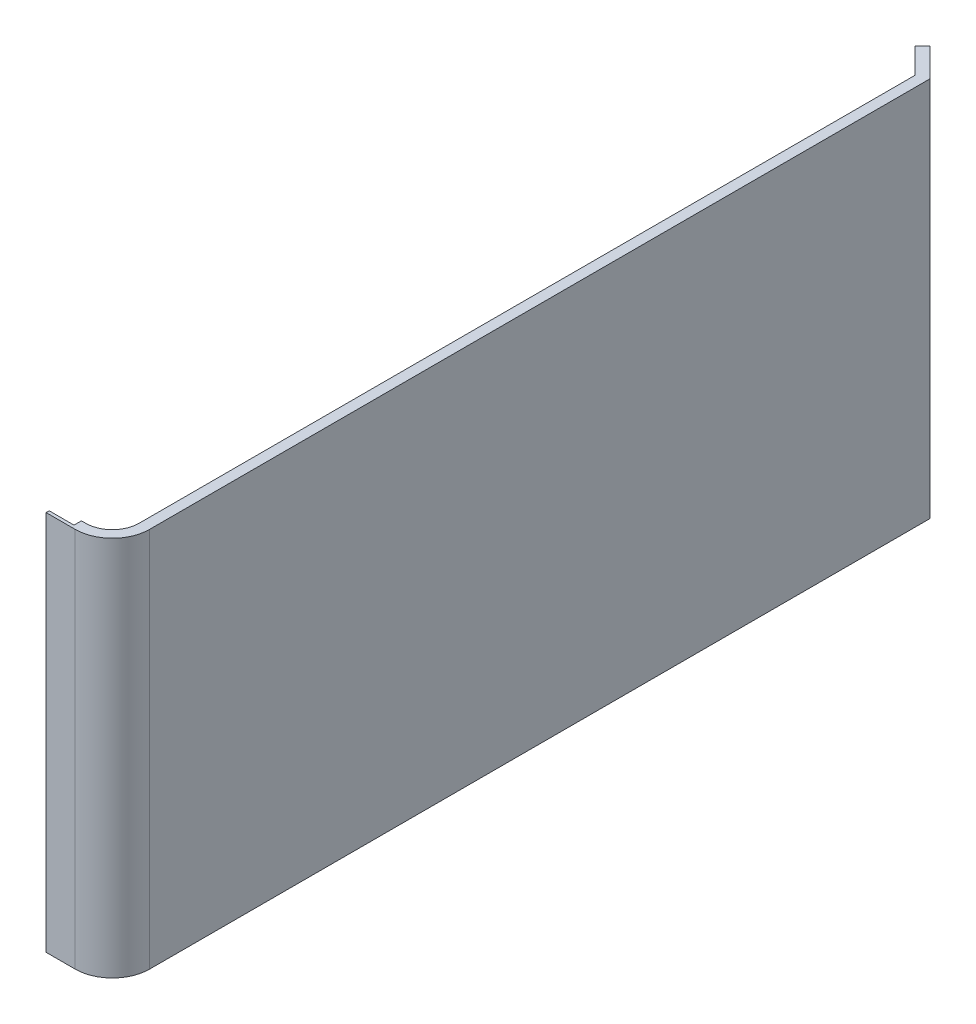
ISO-10303-21;
HEADER;
FILE_DESCRIPTION(('STEP AP214'),'2;1');
FILE_NAME('part.step','',(''),(''),'','','');
FILE_SCHEMA(('AUTOMOTIVE_DESIGN { 1 0 10303 214 1 1 1 1 }'));
ENDSEC;
DATA;
#1=APPLICATION_CONTEXT('core data for automotive mechanical design processes');
#2=APPLICATION_PROTOCOL_DEFINITION('international standard','automotive_design',2000,#1);
#3=PRODUCT_CONTEXT('',#1,'mechanical');
#4=PRODUCT('Part','Part','',(#3));
#5=PRODUCT_RELATED_PRODUCT_CATEGORY('part','',(#4));
#6=PRODUCT_DEFINITION_FORMATION('','',#4);
#7=PRODUCT_DEFINITION_CONTEXT('part definition',#1,'design');
#8=PRODUCT_DEFINITION('design','',#6,#7);
#9=PRODUCT_DEFINITION_SHAPE('','',#8);
#10=(LENGTH_UNIT() NAMED_UNIT(*) SI_UNIT(.MILLI.,.METRE.));
#11=(NAMED_UNIT(*) PLANE_ANGLE_UNIT() SI_UNIT($,.RADIAN.));
#12=(NAMED_UNIT(*) SI_UNIT($,.STERADIAN.) SOLID_ANGLE_UNIT());
#13=UNCERTAINTY_MEASURE_WITH_UNIT(LENGTH_MEASURE(1.E-05),#10,'distance_accuracy_value','');
#14=(GEOMETRIC_REPRESENTATION_CONTEXT(3) GLOBAL_UNCERTAINTY_ASSIGNED_CONTEXT((#13)) GLOBAL_UNIT_ASSIGNED_CONTEXT((#10,
#11,#12)) REPRESENTATION_CONTEXT('',''));
#15=CARTESIAN_POINT('',(0.,0.,0.));
#16=DIRECTION('',(0.,0.,1.));
#17=DIRECTION('',(1.,0.,0.));
#18=AXIS2_PLACEMENT_3D('',#15,#16,#17);
#19=CARTESIAN_POINT('',(727.000000000045,-43.4999999999996,1347.99999999955));
#20=DIRECTION('',(0.,1.,0.));
#21=DIRECTION('',(0.,0.,1.));
#22=AXIS2_PLACEMENT_3D('',#19,#20,#21);
#23=PLANE('',#22);
#24=CARTESIAN_POINT('',(667.000000000045,-43.4999999999996,1949.99999999955));
#25=DIRECTION('',(0.,1.,0.));
#26=DIRECTION('',(0.,0.,1.));
#27=AXIS2_PLACEMENT_3D('',#24,#25,#26);
#28=CIRCLE('',#27,60.);
#29=CARTESIAN_POINT('',(667.000000000045,-43.4999999999996,2009.99999999955));
#30=VERTEX_POINT('',#29);
#31=CARTESIAN_POINT('',(727.000000000045,-43.4999999999996,1949.99999999955));
#32=VERTEX_POINT('',#31);
#33=EDGE_CURVE('E117',#30,#32,#28,.T.);
#34=ORIENTED_EDGE('',*,*,#33,.F.);
#35=DIRECTION('',(1.,0.,0.));
#36=VECTOR('',#35,1.);
#37=CARTESIAN_POINT('',(620.000000000045,-43.4999999999996,2009.99999999955));
#38=LINE('',#37,#36);
#39=CARTESIAN_POINT('',(620.000000000045,-43.4999999999996,2009.99999999955));
#40=VERTEX_POINT('',#39);
#41=EDGE_CURVE('E36',#40,#30,#38,.T.);
#42=ORIENTED_EDGE('',*,*,#41,.F.);
#43=DIRECTION('',(0.,0.,1.));
#44=VECTOR('',#43,1.);
#45=CARTESIAN_POINT('',(620.000000000045,-43.4999999999996,2004.99999999954));
#46=LINE('',#45,#44);
#47=CARTESIAN_POINT('',(620.000000000045,-43.4999999999996,2004.99999999954));
#48=VERTEX_POINT('',#47);
#49=EDGE_CURVE('E161',#48,#40,#46,.T.);
#50=ORIENTED_EDGE('',*,*,#49,.F.);
#51=DIRECTION('',(-1.,0.,0.));
#52=VECTOR('',#51,1.);
#53=CARTESIAN_POINT('',(660.000000000045,-43.4999999999996,2004.99999999954));
#54=LINE('',#53,#52);
#55=CARTESIAN_POINT('',(660.000000000045,-43.4999999999996,2004.99999999954));
#56=VERTEX_POINT('',#55);
#57=EDGE_CURVE('E149',#56,#48,#54,.T.);
#58=ORIENTED_EDGE('',*,*,#57,.F.);
#59=DIRECTION('',(0.,0.,1.));
#60=VECTOR('',#59,1.);
#61=CARTESIAN_POINT('',(660.000000000045,-43.4999999999996,1992.99999999955));
#62=LINE('',#61,#60);
#63=CARTESIAN_POINT('',(660.000000000045,-43.4999999999996,1992.99999999955));
#64=VERTEX_POINT('',#63);
#65=EDGE_CURVE('E139',#64,#56,#62,.T.);
#66=ORIENTED_EDGE('',*,*,#65,.F.);
#67=DIRECTION('',(-1.,0.,0.));
#68=VECTOR('',#67,1.);
#69=CARTESIAN_POINT('',(667.000000000045,-43.4999999999996,1992.99999999955));
#70=LINE('',#69,#68);
#71=CARTESIAN_POINT('',(667.000000000045,-43.4999999999996,1992.99999999955));
#72=VERTEX_POINT('',#71);
#73=EDGE_CURVE('E140',#72,#64,#70,.T.);
#74=ORIENTED_EDGE('',*,*,#73,.F.);
#75=CARTESIAN_POINT('',(667.000000000045,-43.4999999999996,1949.99999999955));
#76=DIRECTION('',(0.,-1.,0.));
#77=DIRECTION('',(1.,0.,0.));
#78=AXIS2_PLACEMENT_3D('',#75,#76,#77);
#79=CIRCLE('',#78,43.);
#80=CARTESIAN_POINT('',(710.000000000045,-43.4999999999996,1949.99999999955));
#81=VERTEX_POINT('',#80);
#82=EDGE_CURVE('E177',#81,#72,#79,.T.);
#83=ORIENTED_EDGE('',*,*,#82,.F.);
#84=DIRECTION('',(0.,0.,1.));
#85=VECTOR('',#84,1.);
#86=CARTESIAN_POINT('',(710.000000000045,-43.5,697.041630559846));
#87=LINE('',#86,#85);
#88=CARTESIAN_POINT('',(710.000000000045,-43.5,697.041630559846));
#89=VERTEX_POINT('',#88);
#90=EDGE_CURVE('E133',#89,#81,#87,.T.);
#91=ORIENTED_EDGE('',*,*,#90,.F.);
#92=DIRECTION('',(0.707106781186548,0.,0.707106781186548));
#93=VECTOR('',#92,1.);
#94=CARTESIAN_POINT('',(669.017243942745,-43.5,656.058874502546));
#95=LINE('',#94,#93);
#96=CARTESIAN_POINT('',(669.017243942745,-43.5,656.058874502546));
#97=VERTEX_POINT('',#96);
#98=EDGE_CURVE('E134',#97,#89,#95,.T.);
#99=ORIENTED_EDGE('',*,*,#98,.F.);
#100=DIRECTION('',(-0.707106781186598,0.,0.707106781186498));
#101=VECTOR('',#100,1.);
#102=CARTESIAN_POINT('',(681.038059222915,-43.5,644.038059222446));
#103=LINE('',#102,#101);
#104=CARTESIAN_POINT('',(681.038059222915,-43.5,644.038059222446));
#105=VERTEX_POINT('',#104);
#106=EDGE_CURVE('E174',#105,#97,#103,.T.);
#107=ORIENTED_EDGE('',*,*,#106,.F.);
#108=DIRECTION('',(-0.707106781186548,0.,-0.707106781186548));
#109=VECTOR('',#108,1.);
#110=CARTESIAN_POINT('',(727.000000000045,-43.5,689.999999999546));
#111=LINE('',#110,#109);
#112=CARTESIAN_POINT('',(727.000000000045,-43.5,689.999999999546));
#113=VERTEX_POINT('',#112);
#114=EDGE_CURVE('E175',#113,#105,#111,.T.);
#115=ORIENTED_EDGE('',*,*,#114,.F.);
#116=DIRECTION('',(0.,0.,-1.));
#117=VECTOR('',#116,1.);
#118=CARTESIAN_POINT('',(727.000000000045,-43.4999999999996,1949.99999999955));
#119=LINE('',#118,#117);
#120=EDGE_CURVE('E27',#32,#113,#119,.T.);
#121=ORIENTED_EDGE('',*,*,#120,.F.);
#122=EDGE_LOOP('',(#34,#42,#50,#58,#66,#74,#83,#91,#99,#107,#115,#121));
#123=FACE_BOUND('',#122,.T.);
#124=ADVANCED_FACE('F17',(#123),#23,.F.);
#125=CARTESIAN_POINT('',(727.000000000045,-43.4999999999996,1949.99999999955));
#126=DIRECTION('',(1.,0.,0.));
#127=DIRECTION('',(0.,1.,0.));
#128=AXIS2_PLACEMENT_3D('',#125,#126,#127);
#129=PLANE('',#128);
#130=DIRECTION('',(0.,1.,0.));
#131=VECTOR('',#130,1.);
#132=CARTESIAN_POINT('',(727.000000000045,-43.5,689.999999999546));
#133=LINE('',#132,#131);
#134=CARTESIAN_POINT('',(727.000000000045,571.5,689.999999999546));
#135=VERTEX_POINT('',#134);
#136=EDGE_CURVE('E11',#113,#135,#133,.T.);
#137=ORIENTED_EDGE('',*,*,#136,.T.);
#138=DIRECTION('',(0.,0.,-1.));
#139=VECTOR('',#138,1.);
#140=CARTESIAN_POINT('',(727.000000000045,571.5,1949.99999999955));
#141=LINE('',#140,#139);
#142=CARTESIAN_POINT('',(727.000000000045,571.5,1949.99999999955));
#143=VERTEX_POINT('',#142);
#144=EDGE_CURVE('E113',#143,#135,#141,.T.);
#145=ORIENTED_EDGE('',*,*,#144,.F.);
#146=DIRECTION('',(0.,1.,0.));
#147=VECTOR('',#146,1.);
#148=CARTESIAN_POINT('',(727.000000000045,-43.4999999999996,1949.99999999955));
#149=LINE('',#148,#147);
#150=EDGE_CURVE('E109',#32,#143,#149,.T.);
#151=ORIENTED_EDGE('',*,*,#150,.F.);
#152=ORIENTED_EDGE('',*,*,#120,.T.);
#153=EDGE_LOOP('',(#137,#145,#151,#152));
#154=FACE_BOUND('',#153,.T.);
#155=ADVANCED_FACE('F224',(#154),#129,.T.);
#156=CARTESIAN_POINT('',(667.000000000045,-43.4999999999996,1949.99999999955));
#157=DIRECTION('',(0.,1.,0.));
#158=DIRECTION('',(0.,0.,-1.));
#159=AXIS2_PLACEMENT_3D('',#156,#157,#158);
#160=CYLINDRICAL_SURFACE('',#159,60.);
#161=ORIENTED_EDGE('',*,*,#150,.T.);
#162=CARTESIAN_POINT('',(667.000000000045,571.5,1949.99999999955));
#163=DIRECTION('',(0.,1.,0.));
#164=DIRECTION('',(0.,0.,1.));
#165=AXIS2_PLACEMENT_3D('',#162,#163,#164);
#166=CIRCLE('',#165,60.);
#167=CARTESIAN_POINT('',(667.000000000045,571.5,2009.99999999955));
#168=VERTEX_POINT('',#167);
#169=EDGE_CURVE('E105',#168,#143,#166,.T.);
#170=ORIENTED_EDGE('',*,*,#169,.F.);
#171=DIRECTION('',(0.,1.,0.));
#172=VECTOR('',#171,1.);
#173=CARTESIAN_POINT('',(667.000000000045,-43.4999999999996,2009.99999999955));
#174=LINE('',#173,#172);
#175=EDGE_CURVE('E107',#30,#168,#174,.T.);
#176=ORIENTED_EDGE('',*,*,#175,.F.);
#177=ORIENTED_EDGE('',*,*,#33,.T.);
#178=EDGE_LOOP('',(#161,#170,#176,#177));
#179=FACE_BOUND('',#178,.T.);
#180=ADVANCED_FACE('F106',(#179),#160,.T.);
#181=CARTESIAN_POINT('',(620.000000000045,-43.4999999999996,2009.99999999955));
#182=DIRECTION('',(0.,0.,1.));
#183=DIRECTION('',(0.,1.,0.));
#184=AXIS2_PLACEMENT_3D('',#181,#182,#183);
#185=PLANE('',#184);
#186=ORIENTED_EDGE('',*,*,#175,.T.);
#187=DIRECTION('',(1.,0.,0.));
#188=VECTOR('',#187,1.);
#189=CARTESIAN_POINT('',(620.000000000045,571.5,2009.99999999955));
#190=LINE('',#189,#188);
#191=CARTESIAN_POINT('',(620.000000000045,571.5,2009.99999999955));
#192=VERTEX_POINT('',#191);
#193=EDGE_CURVE('E112',#192,#168,#190,.T.);
#194=ORIENTED_EDGE('',*,*,#193,.F.);
#195=DIRECTION('',(0.,1.,0.));
#196=VECTOR('',#195,1.);
#197=CARTESIAN_POINT('',(620.000000000045,-43.4999999999996,2009.99999999955));
#198=LINE('',#197,#196);
#199=EDGE_CURVE('E164',#40,#192,#198,.T.);
#200=ORIENTED_EDGE('',*,*,#199,.F.);
#201=ORIENTED_EDGE('',*,*,#41,.T.);
#202=EDGE_LOOP('',(#186,#194,#200,#201));
#203=FACE_BOUND('',#202,.T.);
#204=ADVANCED_FACE('F115',(#203),#185,.T.);
#205=CARTESIAN_POINT('',(620.000000000045,-43.4999999999996,2004.99999999954));
#206=DIRECTION('',(-1.,0.,0.));
#207=DIRECTION('',(0.,0.,-1.));
#208=AXIS2_PLACEMENT_3D('',#205,#206,#207);
#209=PLANE('',#208);
#210=ORIENTED_EDGE('',*,*,#199,.T.);
#211=DIRECTION('',(0.,0.,1.));
#212=VECTOR('',#211,1.);
#213=CARTESIAN_POINT('',(620.000000000045,571.5,2004.99999999954));
#214=LINE('',#213,#212);
#215=CARTESIAN_POINT('',(620.000000000045,571.5,2004.99999999954));
#216=VERTEX_POINT('',#215);
#217=EDGE_CURVE('E123',#216,#192,#214,.T.);
#218=ORIENTED_EDGE('',*,*,#217,.F.);
#219=DIRECTION('',(0.,1.,0.));
#220=VECTOR('',#219,1.);
#221=CARTESIAN_POINT('',(620.000000000045,-43.4999999999996,2004.99999999954));
#222=LINE('',#221,#220);
#223=EDGE_CURVE('E155',#48,#216,#222,.T.);
#224=ORIENTED_EDGE('',*,*,#223,.F.);
#225=ORIENTED_EDGE('',*,*,#49,.T.);
#226=EDGE_LOOP('',(#210,#218,#224,#225));
#227=FACE_BOUND('',#226,.T.);
#228=ADVANCED_FACE('F19',(#227),#209,.T.);
#229=CARTESIAN_POINT('',(660.000000000045,-43.4999999999996,2004.99999999954));
#230=DIRECTION('',(0.,0.,-1.));
#231=DIRECTION('',(-1.,0.,0.));
#232=AXIS2_PLACEMENT_3D('',#229,#230,#231);
#233=PLANE('',#232);
#234=ORIENTED_EDGE('',*,*,#223,.T.);
#235=DIRECTION('',(-1.,0.,0.));
#236=VECTOR('',#235,1.);
#237=CARTESIAN_POINT('',(660.000000000045,571.5,2004.99999999954));
#238=LINE('',#237,#236);
#239=CARTESIAN_POINT('',(660.000000000045,571.5,2004.99999999954));
#240=VERTEX_POINT('',#239);
#241=EDGE_CURVE('E125',#240,#216,#238,.T.);
#242=ORIENTED_EDGE('',*,*,#241,.F.);
#243=DIRECTION('',(0.,1.,0.));
#244=VECTOR('',#243,1.);
#245=CARTESIAN_POINT('',(660.000000000045,-43.4999999999996,2004.99999999954));
#246=LINE('',#245,#244);
#247=EDGE_CURVE('E146',#56,#240,#246,.T.);
#248=ORIENTED_EDGE('',*,*,#247,.F.);
#249=ORIENTED_EDGE('',*,*,#57,.T.);
#250=EDGE_LOOP('',(#234,#242,#248,#249));
#251=FACE_BOUND('',#250,.T.);
#252=ADVANCED_FACE('F234',(#251),#233,.T.);
#253=CARTESIAN_POINT('',(660.000000000045,-43.4999999999996,1992.99999999955));
#254=DIRECTION('',(-1.,0.,0.));
#255=DIRECTION('',(0.,0.,-1.));
#256=AXIS2_PLACEMENT_3D('',#253,#254,#255);
#257=PLANE('',#256);
#258=ORIENTED_EDGE('',*,*,#247,.T.);
#259=DIRECTION('',(0.,0.,1.));
#260=VECTOR('',#259,1.);
#261=CARTESIAN_POINT('',(660.000000000045,571.5,1992.99999999955));
#262=LINE('',#261,#260);
#263=CARTESIAN_POINT('',(660.000000000045,571.5,1992.99999999955));
#264=VERTEX_POINT('',#263);
#265=EDGE_CURVE('E21',#264,#240,#262,.T.);
#266=ORIENTED_EDGE('',*,*,#265,.F.);
#267=DIRECTION('',(0.,1.,0.));
#268=VECTOR('',#267,1.);
#269=CARTESIAN_POINT('',(660.000000000045,-43.4999999999996,1992.99999999955));
#270=LINE('',#269,#268);
#271=EDGE_CURVE('E136',#64,#264,#270,.T.);
#272=ORIENTED_EDGE('',*,*,#271,.F.);
#273=ORIENTED_EDGE('',*,*,#65,.T.);
#274=EDGE_LOOP('',(#258,#266,#272,#273));
#275=FACE_BOUND('',#274,.T.);
#276=ADVANCED_FACE('F236',(#275),#257,.T.);
#277=CARTESIAN_POINT('',(667.000000000045,-43.4999999999996,1992.99999999955));
#278=DIRECTION('',(0.,0.,-1.));
#279=DIRECTION('',(-1.,0.,0.));
#280=AXIS2_PLACEMENT_3D('',#277,#278,#279);
#281=PLANE('',#280);
#282=ORIENTED_EDGE('',*,*,#271,.T.);
#283=DIRECTION('',(-1.,0.,0.));
#284=VECTOR('',#283,1.);
#285=CARTESIAN_POINT('',(667.000000000045,571.5,1992.99999999955));
#286=LINE('',#285,#284);
#287=CARTESIAN_POINT('',(667.000000000045,571.5,1992.99999999955));
#288=VERTEX_POINT('',#287);
#289=EDGE_CURVE('E194',#288,#264,#286,.T.);
#290=ORIENTED_EDGE('',*,*,#289,.F.);
#291=DIRECTION('',(0.,1.,0.));
#292=VECTOR('',#291,1.);
#293=CARTESIAN_POINT('',(667.000000000045,-43.4999999999996,1992.99999999955));
#294=LINE('',#293,#292);
#295=EDGE_CURVE('E153',#72,#288,#294,.T.);
#296=ORIENTED_EDGE('',*,*,#295,.F.);
#297=ORIENTED_EDGE('',*,*,#73,.T.);
#298=EDGE_LOOP('',(#282,#290,#296,#297));
#299=FACE_BOUND('',#298,.T.);
#300=ADVANCED_FACE('F247',(#299),#281,.T.);
#301=CARTESIAN_POINT('',(667.000000000045,-43.4999999999996,1949.99999999955));
#302=DIRECTION('',(0.,1.,0.));
#303=DIRECTION('',(0.,0.,-1.));
#304=AXIS2_PLACEMENT_3D('',#301,#302,#303);
#305=CYLINDRICAL_SURFACE('',#304,43.);
#306=ORIENTED_EDGE('',*,*,#295,.T.);
#307=CARTESIAN_POINT('',(667.000000000045,571.5,1949.99999999955));
#308=DIRECTION('',(0.,-1.,0.));
#309=DIRECTION('',(1.,0.,0.));
#310=AXIS2_PLACEMENT_3D('',#307,#308,#309);
#311=CIRCLE('',#310,43.);
#312=CARTESIAN_POINT('',(710.000000000045,571.5,1949.99999999955));
#313=VERTEX_POINT('',#312);
#314=EDGE_CURVE('E152',#313,#288,#311,.T.);
#315=ORIENTED_EDGE('',*,*,#314,.F.);
#316=DIRECTION('',(0.,1.,0.));
#317=VECTOR('',#316,1.);
#318=CARTESIAN_POINT('',(710.000000000045,-43.4999999999996,1949.99999999955));
#319=LINE('',#318,#317);
#320=EDGE_CURVE('E168',#81,#313,#319,.T.);
#321=ORIENTED_EDGE('',*,*,#320,.F.);
#322=ORIENTED_EDGE('',*,*,#82,.T.);
#323=EDGE_LOOP('',(#306,#315,#321,#322));
#324=FACE_BOUND('',#323,.T.);
#325=ADVANCED_FACE('F250',(#324),#305,.F.);
#326=CARTESIAN_POINT('',(710.000000000045,-43.5,697.041630559846));
#327=DIRECTION('',(-1.,0.,0.));
#328=DIRECTION('',(0.,0.,-1.));
#329=AXIS2_PLACEMENT_3D('',#326,#327,#328);
#330=PLANE('',#329);
#331=ORIENTED_EDGE('',*,*,#320,.T.);
#332=DIRECTION('',(0.,0.,1.));
#333=VECTOR('',#332,1.);
#334=CARTESIAN_POINT('',(710.000000000045,571.5,697.041630559846));
#335=LINE('',#334,#333);
#336=CARTESIAN_POINT('',(710.000000000045,571.5,697.041630559846));
#337=VERTEX_POINT('',#336);
#338=EDGE_CURVE('E145',#337,#313,#335,.T.);
#339=ORIENTED_EDGE('',*,*,#338,.F.);
#340=DIRECTION('',(0.,1.,0.));
#341=VECTOR('',#340,1.);
#342=CARTESIAN_POINT('',(710.000000000045,-43.5,697.041630559846));
#343=LINE('',#342,#341);
#344=EDGE_CURVE('E130',#89,#337,#343,.T.);
#345=ORIENTED_EDGE('',*,*,#344,.F.);
#346=ORIENTED_EDGE('',*,*,#90,.T.);
#347=EDGE_LOOP('',(#331,#339,#345,#346));
#348=FACE_BOUND('',#347,.T.);
#349=ADVANCED_FACE('F218',(#348),#330,.T.);
#350=CARTESIAN_POINT('',(669.017243942745,-43.5,656.058874502546));
#351=DIRECTION('',(-0.707106781186548,0.,0.707106781186548));
#352=DIRECTION('',(0.,-1.,0.));
#353=AXIS2_PLACEMENT_3D('',#350,#351,#352);
#354=PLANE('',#353);
#355=ORIENTED_EDGE('',*,*,#344,.T.);
#356=DIRECTION('',(0.707106781186548,0.,0.707106781186548));
#357=VECTOR('',#356,1.);
#358=CARTESIAN_POINT('',(669.017243942745,571.5,656.058874502546));
#359=LINE('',#358,#357);
#360=CARTESIAN_POINT('',(669.017243942745,571.5,656.058874502546));
#361=VERTEX_POINT('',#360);
#362=EDGE_CURVE('E141',#361,#337,#359,.T.);
#363=ORIENTED_EDGE('',*,*,#362,.F.);
#364=DIRECTION('',(0.,1.,0.));
#365=VECTOR('',#364,1.);
#366=CARTESIAN_POINT('',(669.017243942745,-43.5,656.058874502546));
#367=LINE('',#366,#365);
#368=EDGE_CURVE('E178',#97,#361,#367,.T.);
#369=ORIENTED_EDGE('',*,*,#368,.F.);
#370=ORIENTED_EDGE('',*,*,#98,.T.);
#371=EDGE_LOOP('',(#355,#363,#369,#370));
#372=FACE_BOUND('',#371,.T.);
#373=ADVANCED_FACE('F210',(#372),#354,.T.);
#374=CARTESIAN_POINT('',(681.038059222915,-43.5,644.038059222446));
#375=DIRECTION('',(-0.707106781186548,0.,-0.707106781186548));
#376=DIRECTION('',(0.707106781186548,0.,-0.707106781186548));
#377=AXIS2_PLACEMENT_3D('',#374,#375,#376);
#378=PLANE('',#377);
#379=ORIENTED_EDGE('',*,*,#368,.T.);
#380=DIRECTION('',(-0.707106781186598,0.,0.707106781186498));
#381=VECTOR('',#380,1.);
#382=CARTESIAN_POINT('',(681.038059222915,571.5,644.038059222446));
#383=LINE('',#382,#381);
#384=CARTESIAN_POINT('',(681.038059222915,571.5,644.038059222446));
#385=VERTEX_POINT('',#384);
#386=EDGE_CURVE('E144',#385,#361,#383,.T.);
#387=ORIENTED_EDGE('',*,*,#386,.F.);
#388=DIRECTION('',(0.,1.,0.));
#389=VECTOR('',#388,1.);
#390=CARTESIAN_POINT('',(681.038059222915,-43.5,644.038059222446));
#391=LINE('',#390,#389);
#392=EDGE_CURVE('E171',#105,#385,#391,.T.);
#393=ORIENTED_EDGE('',*,*,#392,.F.);
#394=ORIENTED_EDGE('',*,*,#106,.T.);
#395=EDGE_LOOP('',(#379,#387,#393,#394));
#396=FACE_BOUND('',#395,.T.);
#397=ADVANCED_FACE('F208',(#396),#378,.T.);
#398=CARTESIAN_POINT('',(727.000000000045,-43.5,689.999999999546));
#399=DIRECTION('',(0.707106781186548,0.,-0.707106781186548));
#400=DIRECTION('',(0.,-1.,0.));
#401=AXIS2_PLACEMENT_3D('',#398,#399,#400);
#402=PLANE('',#401);
#403=ORIENTED_EDGE('',*,*,#392,.T.);
#404=DIRECTION('',(-0.707106781186548,0.,-0.707106781186548));
#405=VECTOR('',#404,1.);
#406=CARTESIAN_POINT('',(727.000000000045,571.5,689.999999999546));
#407=LINE('',#406,#405);
#408=EDGE_CURVE('E201',#135,#385,#407,.T.);
#409=ORIENTED_EDGE('',*,*,#408,.F.);
#410=ORIENTED_EDGE('',*,*,#136,.F.);
#411=ORIENTED_EDGE('',*,*,#114,.T.);
#412=EDGE_LOOP('',(#403,#409,#410,#411));
#413=FACE_BOUND('',#412,.T.);
#414=ADVANCED_FACE('F207',(#413),#402,.T.);
#415=CARTESIAN_POINT('',(727.000000000045,571.5,1347.99999999955));
#416=DIRECTION('',(0.,1.,0.));
#417=DIRECTION('',(0.,0.,1.));
#418=AXIS2_PLACEMENT_3D('',#415,#416,#417);
#419=PLANE('',#418);
#420=ORIENTED_EDGE('',*,*,#408,.T.);
#421=ORIENTED_EDGE('',*,*,#386,.T.);
#422=ORIENTED_EDGE('',*,*,#362,.T.);
#423=ORIENTED_EDGE('',*,*,#338,.T.);
#424=ORIENTED_EDGE('',*,*,#314,.T.);
#425=ORIENTED_EDGE('',*,*,#289,.T.);
#426=ORIENTED_EDGE('',*,*,#265,.T.);
#427=ORIENTED_EDGE('',*,*,#241,.T.);
#428=ORIENTED_EDGE('',*,*,#217,.T.);
#429=ORIENTED_EDGE('',*,*,#193,.T.);
#430=ORIENTED_EDGE('',*,*,#169,.T.);
#431=ORIENTED_EDGE('',*,*,#144,.T.);
#432=EDGE_LOOP('',(#420,#421,#422,#423,#424,#425,#426,#427,#428,#429,#430,#431));
#433=FACE_BOUND('',#432,.T.);
#434=ADVANCED_FACE('F121',(#433),#419,.T.);
#435=CLOSED_SHELL('',(#124,#155,#180,#204,#228,#252,#276,#300,#325,#349,#373,#397,#414,#434));
#436=MANIFOLD_SOLID_BREP('B1',#435);
#437=ADVANCED_BREP_SHAPE_REPRESENTATION('',(#18,#436),#14);
#438=SHAPE_DEFINITION_REPRESENTATION(#9,#437);
ENDSEC;
END-ISO-10303-21;
